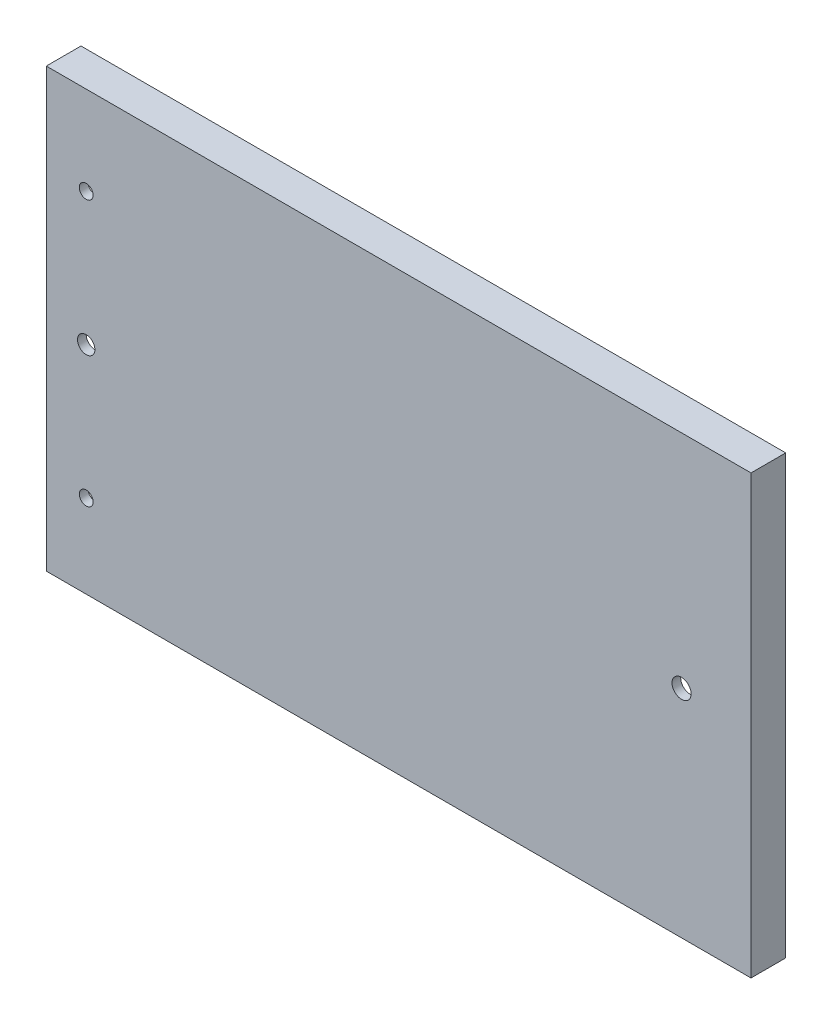
ISO-10303-21;
HEADER;
FILE_DESCRIPTION(('STEP AP214'),'2;1');
FILE_NAME('part.step','',(''),(''),'','','');
FILE_SCHEMA(('AUTOMOTIVE_DESIGN { 1 0 10303 214 1 1 1 1 }'));
ENDSEC;
DATA;
#1=APPLICATION_CONTEXT('core data for automotive mechanical design processes');
#2=APPLICATION_PROTOCOL_DEFINITION('international standard','automotive_design',2000,#1);
#3=PRODUCT_CONTEXT('',#1,'mechanical');
#4=PRODUCT('Part','Part','',(#3));
#5=PRODUCT_RELATED_PRODUCT_CATEGORY('part','',(#4));
#6=PRODUCT_DEFINITION_FORMATION('','',#4);
#7=PRODUCT_DEFINITION_CONTEXT('part definition',#1,'design');
#8=PRODUCT_DEFINITION('design','',#6,#7);
#9=PRODUCT_DEFINITION_SHAPE('','',#8);
#10=(LENGTH_UNIT() NAMED_UNIT(*) SI_UNIT(.MILLI.,.METRE.));
#11=(NAMED_UNIT(*) PLANE_ANGLE_UNIT() SI_UNIT($,.RADIAN.));
#12=(NAMED_UNIT(*) SI_UNIT($,.STERADIAN.) SOLID_ANGLE_UNIT());
#13=UNCERTAINTY_MEASURE_WITH_UNIT(LENGTH_MEASURE(1.E-05),#10,'distance_accuracy_value','');
#14=(GEOMETRIC_REPRESENTATION_CONTEXT(3) GLOBAL_UNCERTAINTY_ASSIGNED_CONTEXT((#13)) GLOBAL_UNIT_ASSIGNED_CONTEXT((#10,
#11,#12)) REPRESENTATION_CONTEXT('',''));
#15=CARTESIAN_POINT('',(0.,0.,0.));
#16=DIRECTION('',(0.,0.,1.));
#17=DIRECTION('',(1.,0.,0.));
#18=AXIS2_PLACEMENT_3D('',#15,#16,#17);
#19=CARTESIAN_POINT('',(0.,0.,20.));
#20=DIRECTION('',(-1.,0.,0.));
#21=DIRECTION('',(0.,0.,1.));
#22=AXIS2_PLACEMENT_3D('',#19,#20,#21);
#23=PLANE('',#22);
#24=DIRECTION('',(0.,1.,0.));
#25=VECTOR('',#24,1.);
#26=CARTESIAN_POINT('',(0.,0.,0.));
#27=LINE('',#26,#25);
#28=CARTESIAN_POINT('',(0.,0.,0.));
#29=VERTEX_POINT('',#28);
#30=CARTESIAN_POINT('',(0.,252.,0.));
#31=VERTEX_POINT('',#30);
#32=EDGE_CURVE('E143',#29,#31,#27,.T.);
#33=ORIENTED_EDGE('',*,*,#32,.F.);
#34=DIRECTION('',(0.,0.,-1.));
#35=VECTOR('',#34,1.);
#36=CARTESIAN_POINT('',(0.,0.,20.));
#37=LINE('',#36,#35);
#38=CARTESIAN_POINT('',(0.,0.,20.));
#39=VERTEX_POINT('',#38);
#40=EDGE_CURVE('E11',#39,#29,#37,.T.);
#41=ORIENTED_EDGE('',*,*,#40,.F.);
#42=DIRECTION('',(0.,1.,0.));
#43=VECTOR('',#42,1.);
#44=CARTESIAN_POINT('',(0.,0.,20.));
#45=LINE('',#44,#43);
#46=CARTESIAN_POINT('',(0.,252.,20.));
#47=VERTEX_POINT('',#46);
#48=EDGE_CURVE('E147',#39,#47,#45,.T.);
#49=ORIENTED_EDGE('',*,*,#48,.T.);
#50=DIRECTION('',(0.,0.,-1.));
#51=VECTOR('',#50,1.);
#52=CARTESIAN_POINT('',(0.,252.,20.));
#53=LINE('',#52,#51);
#54=EDGE_CURVE('E36',#47,#31,#53,.T.);
#55=ORIENTED_EDGE('',*,*,#54,.T.);
#56=EDGE_LOOP('',(#33,#41,#49,#55));
#57=FACE_BOUND('',#56,.T.);
#58=ADVANCED_FACE('F33',(#57),#23,.T.);
#59=CARTESIAN_POINT('',(406.,0.,20.));
#60=DIRECTION('',(0.,-1.,0.));
#61=DIRECTION('',(0.,0.,-1.));
#62=AXIS2_PLACEMENT_3D('',#59,#60,#61);
#63=PLANE('',#62);
#64=DIRECTION('',(-1.,0.,0.));
#65=VECTOR('',#64,1.);
#66=CARTESIAN_POINT('',(406.,0.,0.));
#67=LINE('',#66,#65);
#68=CARTESIAN_POINT('',(406.,0.,0.));
#69=VERTEX_POINT('',#68);
#70=EDGE_CURVE('E150',#69,#29,#67,.T.);
#71=ORIENTED_EDGE('',*,*,#70,.F.);
#72=DIRECTION('',(0.,0.,-1.));
#73=VECTOR('',#72,1.);
#74=CARTESIAN_POINT('',(406.,0.,20.));
#75=LINE('',#74,#73);
#76=CARTESIAN_POINT('',(406.,0.,20.));
#77=VERTEX_POINT('',#76);
#78=EDGE_CURVE('E41',#77,#69,#75,.T.);
#79=ORIENTED_EDGE('',*,*,#78,.F.);
#80=DIRECTION('',(-1.,0.,0.));
#81=VECTOR('',#80,1.);
#82=CARTESIAN_POINT('',(406.,0.,20.));
#83=LINE('',#82,#81);
#84=EDGE_CURVE('E155',#77,#39,#83,.T.);
#85=ORIENTED_EDGE('',*,*,#84,.T.);
#86=ORIENTED_EDGE('',*,*,#40,.T.);
#87=EDGE_LOOP('',(#71,#79,#85,#86));
#88=FACE_BOUND('',#87,.T.);
#89=ADVANCED_FACE('F172',(#88),#63,.T.);
#90=CARTESIAN_POINT('',(406.,252.,20.));
#91=DIRECTION('',(1.,0.,0.));
#92=DIRECTION('',(0.,0.,-1.));
#93=AXIS2_PLACEMENT_3D('',#90,#91,#92);
#94=PLANE('',#93);
#95=DIRECTION('',(0.,-1.,0.));
#96=VECTOR('',#95,1.);
#97=CARTESIAN_POINT('',(406.,252.,0.));
#98=LINE('',#97,#96);
#99=CARTESIAN_POINT('',(406.,252.,0.));
#100=VERTEX_POINT('',#99);
#101=EDGE_CURVE('E162',#100,#69,#98,.T.);
#102=ORIENTED_EDGE('',*,*,#101,.F.);
#103=DIRECTION('',(0.,0.,-1.));
#104=VECTOR('',#103,1.);
#105=CARTESIAN_POINT('',(406.,252.,20.));
#106=LINE('',#105,#104);
#107=CARTESIAN_POINT('',(406.,252.,20.));
#108=VERTEX_POINT('',#107);
#109=EDGE_CURVE('E167',#108,#100,#106,.T.);
#110=ORIENTED_EDGE('',*,*,#109,.F.);
#111=DIRECTION('',(0.,-1.,0.));
#112=VECTOR('',#111,1.);
#113=CARTESIAN_POINT('',(406.,252.,20.));
#114=LINE('',#113,#112);
#115=EDGE_CURVE('E152',#108,#77,#114,.T.);
#116=ORIENTED_EDGE('',*,*,#115,.T.);
#117=ORIENTED_EDGE('',*,*,#78,.T.);
#118=EDGE_LOOP('',(#102,#110,#116,#117));
#119=FACE_BOUND('',#118,.T.);
#120=ADVANCED_FACE('F176',(#119),#94,.T.);
#121=CARTESIAN_POINT('',(0.,252.,20.));
#122=DIRECTION('',(0.,1.,0.));
#123=DIRECTION('',(0.,0.,1.));
#124=AXIS2_PLACEMENT_3D('',#121,#122,#123);
#125=PLANE('',#124);
#126=DIRECTION('',(1.,0.,0.));
#127=VECTOR('',#126,1.);
#128=CARTESIAN_POINT('',(0.,252.,0.));
#129=LINE('',#128,#127);
#130=EDGE_CURVE('E159',#31,#100,#129,.T.);
#131=ORIENTED_EDGE('',*,*,#130,.F.);
#132=ORIENTED_EDGE('',*,*,#54,.F.);
#133=DIRECTION('',(1.,0.,0.));
#134=VECTOR('',#133,1.);
#135=CARTESIAN_POINT('',(0.,252.,20.));
#136=LINE('',#135,#134);
#137=EDGE_CURVE('E149',#47,#108,#136,.T.);
#138=ORIENTED_EDGE('',*,*,#137,.T.);
#139=ORIENTED_EDGE('',*,*,#109,.T.);
#140=EDGE_LOOP('',(#131,#132,#138,#139));
#141=FACE_BOUND('',#140,.T.);
#142=ADVANCED_FACE('F169',(#141),#125,.T.);
#143=CARTESIAN_POINT('',(0.,0.,20.));
#144=DIRECTION('',(0.,0.,-1.));
#145=DIRECTION('',(-1.,0.,0.));
#146=AXIS2_PLACEMENT_3D('',#143,#144,#145);
#147=PLANE('',#146);
#148=CARTESIAN_POINT('',(366.,124.5,20.));
#149=DIRECTION('',(0.,0.,-1.));
#150=DIRECTION('',(-1.,0.,0.));
#151=AXIS2_PLACEMENT_3D('',#148,#149,#150);
#152=CIRCLE('',#151,5.50000000000001);
#153=CARTESIAN_POINT('',(360.5,124.5,20.));
#154=VERTEX_POINT('',#153);
#155=EDGE_CURVE('E306',#154,#154,#152,.T.);
#156=ORIENTED_EDGE('',*,*,#155,.T.);
#157=EDGE_LOOP('',(#156));
#158=FACE_BOUND('',#157,.T.);
#159=CARTESIAN_POINT('',(23.,201.,20.));
#160=DIRECTION('',(0.,0.,-1.));
#161=DIRECTION('',(-1.,0.,0.));
#162=AXIS2_PLACEMENT_3D('',#159,#160,#161);
#163=CIRCLE('',#162,3.99999999999999);
#164=CARTESIAN_POINT('',(19.,201.,20.));
#165=VERTEX_POINT('',#164);
#166=EDGE_CURVE('E316',#165,#165,#163,.T.);
#167=ORIENTED_EDGE('',*,*,#166,.T.);
#168=EDGE_LOOP('',(#167));
#169=FACE_BOUND('',#168,.T.);
#170=CARTESIAN_POINT('',(23.,48.,20.));
#171=DIRECTION('',(0.,0.,-1.));
#172=DIRECTION('',(-1.,0.,0.));
#173=AXIS2_PLACEMENT_3D('',#170,#171,#172);
#174=CIRCLE('',#173,3.99999999999999);
#175=CARTESIAN_POINT('',(19.,48.,20.));
#176=VERTEX_POINT('',#175);
#177=EDGE_CURVE('E322',#176,#176,#174,.T.);
#178=ORIENTED_EDGE('',*,*,#177,.T.);
#179=EDGE_LOOP('',(#178));
#180=FACE_BOUND('',#179,.T.);
#181=CARTESIAN_POINT('',(23.,124.5,20.));
#182=DIRECTION('',(0.,0.,-1.));
#183=DIRECTION('',(-1.,0.,0.));
#184=AXIS2_PLACEMENT_3D('',#181,#182,#183);
#185=CIRCLE('',#184,4.99999999999999);
#186=CARTESIAN_POINT('',(18.,124.5,20.));
#187=VERTEX_POINT('',#186);
#188=EDGE_CURVE('E131',#187,#187,#185,.T.);
#189=ORIENTED_EDGE('',*,*,#188,.T.);
#190=EDGE_LOOP('',(#189));
#191=FACE_BOUND('',#190,.T.);
#192=ORIENTED_EDGE('',*,*,#48,.F.);
#193=ORIENTED_EDGE('',*,*,#84,.F.);
#194=ORIENTED_EDGE('',*,*,#115,.F.);
#195=ORIENTED_EDGE('',*,*,#137,.F.);
#196=EDGE_LOOP('',(#192,#193,#194,#195));
#197=FACE_BOUND('',#196,.T.);
#198=ADVANCED_FACE('F178',(#158,#169,#180,#191,#197),#147,.F.);
#199=CARTESIAN_POINT('',(0.,0.,0.));
#200=DIRECTION('',(0.,0.,-1.));
#201=DIRECTION('',(-1.,0.,0.));
#202=AXIS2_PLACEMENT_3D('',#199,#200,#201);
#203=PLANE('',#202);
#204=DIRECTION('',(1.,0.,0.));
#205=VECTOR('',#204,1.);
#206=CARTESIAN_POINT('',(3.,241.,0.));
#207=LINE('',#206,#205);
#208=CARTESIAN_POINT('',(3.,241.,0.));
#209=VERTEX_POINT('',#208);
#210=CARTESIAN_POINT('',(388.,241.,0.));
#211=VERTEX_POINT('',#210);
#212=EDGE_CURVE('E49',#209,#211,#207,.T.);
#213=ORIENTED_EDGE('',*,*,#212,.F.);
#214=DIRECTION('',(0.,1.,0.));
#215=VECTOR('',#214,1.);
#216=CARTESIAN_POINT('',(3.,8.,0.));
#217=LINE('',#216,#215);
#218=CARTESIAN_POINT('',(3.,8.,0.));
#219=VERTEX_POINT('',#218);
#220=EDGE_CURVE('E125',#219,#209,#217,.T.);
#221=ORIENTED_EDGE('',*,*,#220,.F.);
#222=DIRECTION('',(-1.,0.,0.));
#223=VECTOR('',#222,1.);
#224=CARTESIAN_POINT('',(388.,8.00000000000001,0.));
#225=LINE('',#224,#223);
#226=CARTESIAN_POINT('',(388.,8.00000000000001,0.));
#227=VERTEX_POINT('',#226);
#228=EDGE_CURVE('E128',#227,#219,#225,.T.);
#229=ORIENTED_EDGE('',*,*,#228,.F.);
#230=DIRECTION('',(0.,-1.,0.));
#231=VECTOR('',#230,1.);
#232=CARTESIAN_POINT('',(388.,241.,0.));
#233=LINE('',#232,#231);
#234=EDGE_CURVE('E137',#211,#227,#233,.T.);
#235=ORIENTED_EDGE('',*,*,#234,.F.);
#236=EDGE_LOOP('',(#213,#221,#229,#235));
#237=FACE_BOUND('',#236,.T.);
#238=ORIENTED_EDGE('',*,*,#32,.T.);
#239=ORIENTED_EDGE('',*,*,#130,.T.);
#240=ORIENTED_EDGE('',*,*,#101,.T.);
#241=ORIENTED_EDGE('',*,*,#70,.T.);
#242=EDGE_LOOP('',(#238,#239,#240,#241));
#243=FACE_BOUND('',#242,.T.);
#244=ADVANCED_FACE('F171',(#237,#243),#203,.T.);
#245=CARTESIAN_POINT('',(3.,241.,15.));
#246=DIRECTION('',(0.,1.,0.));
#247=DIRECTION('',(0.,0.,1.));
#248=AXIS2_PLACEMENT_3D('',#245,#246,#247);
#249=PLANE('',#248);
#250=ORIENTED_EDGE('',*,*,#212,.T.);
#251=DIRECTION('',(0.,0.,-1.));
#252=VECTOR('',#251,1.);
#253=CARTESIAN_POINT('',(388.,241.,15.));
#254=LINE('',#253,#252);
#255=CARTESIAN_POINT('',(388.,241.,15.));
#256=VERTEX_POINT('',#255);
#257=EDGE_CURVE('E103',#256,#211,#254,.T.);
#258=ORIENTED_EDGE('',*,*,#257,.F.);
#259=DIRECTION('',(1.,0.,0.));
#260=VECTOR('',#259,1.);
#261=CARTESIAN_POINT('',(3.,241.,15.));
#262=LINE('',#261,#260);
#263=CARTESIAN_POINT('',(3.,241.,15.));
#264=VERTEX_POINT('',#263);
#265=EDGE_CURVE('E107',#264,#256,#262,.T.);
#266=ORIENTED_EDGE('',*,*,#265,.F.);
#267=DIRECTION('',(0.,0.,-1.));
#268=VECTOR('',#267,1.);
#269=CARTESIAN_POINT('',(3.,241.,15.));
#270=LINE('',#269,#268);
#271=EDGE_CURVE('E141',#264,#209,#270,.T.);
#272=ORIENTED_EDGE('',*,*,#271,.T.);
#273=EDGE_LOOP('',(#250,#258,#266,#272));
#274=FACE_BOUND('',#273,.T.);
#275=ADVANCED_FACE('F105',(#274),#249,.F.);
#276=CARTESIAN_POINT('',(3.,8.,15.));
#277=DIRECTION('',(-1.,0.,0.));
#278=DIRECTION('',(0.,-1.,0.));
#279=AXIS2_PLACEMENT_3D('',#276,#277,#278);
#280=PLANE('',#279);
#281=ORIENTED_EDGE('',*,*,#220,.T.);
#282=ORIENTED_EDGE('',*,*,#271,.F.);
#283=DIRECTION('',(0.,1.,0.));
#284=VECTOR('',#283,1.);
#285=CARTESIAN_POINT('',(3.,8.,15.));
#286=LINE('',#285,#284);
#287=CARTESIAN_POINT('',(3.,8.,15.));
#288=VERTEX_POINT('',#287);
#289=EDGE_CURVE('E113',#288,#264,#286,.T.);
#290=ORIENTED_EDGE('',*,*,#289,.F.);
#291=DIRECTION('',(0.,0.,-1.));
#292=VECTOR('',#291,1.);
#293=CARTESIAN_POINT('',(3.,8.,15.));
#294=LINE('',#293,#292);
#295=EDGE_CURVE('E144',#288,#219,#294,.T.);
#296=ORIENTED_EDGE('',*,*,#295,.T.);
#297=EDGE_LOOP('',(#281,#282,#290,#296));
#298=FACE_BOUND('',#297,.T.);
#299=ADVANCED_FACE('F222',(#298),#280,.F.);
#300=CARTESIAN_POINT('',(388.,8.00000000000001,15.));
#301=DIRECTION('',(0.,-1.,0.));
#302=DIRECTION('',(1.,0.,0.));
#303=AXIS2_PLACEMENT_3D('',#300,#301,#302);
#304=PLANE('',#303);
#305=ORIENTED_EDGE('',*,*,#228,.T.);
#306=ORIENTED_EDGE('',*,*,#295,.F.);
#307=DIRECTION('',(-1.,0.,0.));
#308=VECTOR('',#307,1.);
#309=CARTESIAN_POINT('',(388.,8.00000000000001,15.));
#310=LINE('',#309,#308);
#311=CARTESIAN_POINT('',(388.,8.00000000000001,15.));
#312=VERTEX_POINT('',#311);
#313=EDGE_CURVE('E121',#312,#288,#310,.T.);
#314=ORIENTED_EDGE('',*,*,#313,.F.);
#315=DIRECTION('',(0.,0.,-1.));
#316=VECTOR('',#315,1.);
#317=CARTESIAN_POINT('',(388.,8.00000000000001,15.));
#318=LINE('',#317,#316);
#319=EDGE_CURVE('E112',#312,#227,#318,.T.);
#320=ORIENTED_EDGE('',*,*,#319,.T.);
#321=EDGE_LOOP('',(#305,#306,#314,#320));
#322=FACE_BOUND('',#321,.T.);
#323=ADVANCED_FACE('F230',(#322),#304,.F.);
#324=CARTESIAN_POINT('',(388.,241.,15.));
#325=DIRECTION('',(1.,0.,0.));
#326=DIRECTION('',(0.,0.,-1.));
#327=AXIS2_PLACEMENT_3D('',#324,#325,#326);
#328=PLANE('',#327);
#329=ORIENTED_EDGE('',*,*,#234,.T.);
#330=ORIENTED_EDGE('',*,*,#319,.F.);
#331=DIRECTION('',(0.,-1.,0.));
#332=VECTOR('',#331,1.);
#333=CARTESIAN_POINT('',(388.,241.,15.));
#334=LINE('',#333,#332);
#335=EDGE_CURVE('E116',#256,#312,#334,.T.);
#336=ORIENTED_EDGE('',*,*,#335,.F.);
#337=ORIENTED_EDGE('',*,*,#257,.T.);
#338=EDGE_LOOP('',(#329,#330,#336,#337));
#339=FACE_BOUND('',#338,.T.);
#340=ADVANCED_FACE('F117',(#339),#328,.F.);
#341=CARTESIAN_POINT('',(0.,0.,15.));
#342=DIRECTION('',(0.,0.,-1.));
#343=DIRECTION('',(-1.,0.,0.));
#344=AXIS2_PLACEMENT_3D('',#341,#342,#343);
#345=PLANE('',#344);
#346=CARTESIAN_POINT('',(366.,124.5,15.));
#347=DIRECTION('',(0.,0.,-1.));
#348=DIRECTION('',(-1.,0.,0.));
#349=AXIS2_PLACEMENT_3D('',#346,#347,#348);
#350=CIRCLE('',#349,5.50000000000001);
#351=CARTESIAN_POINT('',(360.5,124.5,15.));
#352=VERTEX_POINT('',#351);
#353=EDGE_CURVE('E309',#352,#352,#350,.T.);
#354=ORIENTED_EDGE('',*,*,#353,.F.);
#355=EDGE_LOOP('',(#354));
#356=FACE_BOUND('',#355,.T.);
#357=CARTESIAN_POINT('',(23.,201.,15.));
#358=DIRECTION('',(0.,0.,-1.));
#359=DIRECTION('',(-1.,0.,0.));
#360=AXIS2_PLACEMENT_3D('',#357,#358,#359);
#361=CIRCLE('',#360,3.99999999999999);
#362=CARTESIAN_POINT('',(19.,201.,15.));
#363=VERTEX_POINT('',#362);
#364=EDGE_CURVE('E311',#363,#363,#361,.T.);
#365=ORIENTED_EDGE('',*,*,#364,.F.);
#366=EDGE_LOOP('',(#365));
#367=FACE_BOUND('',#366,.T.);
#368=CARTESIAN_POINT('',(23.,48.,15.));
#369=DIRECTION('',(0.,0.,-1.));
#370=DIRECTION('',(-1.,0.,0.));
#371=AXIS2_PLACEMENT_3D('',#368,#369,#370);
#372=CIRCLE('',#371,3.99999999999999);
#373=CARTESIAN_POINT('',(19.,48.,15.));
#374=VERTEX_POINT('',#373);
#375=EDGE_CURVE('E319',#374,#374,#372,.T.);
#376=ORIENTED_EDGE('',*,*,#375,.F.);
#377=EDGE_LOOP('',(#376));
#378=FACE_BOUND('',#377,.T.);
#379=CARTESIAN_POINT('',(23.,124.5,15.));
#380=DIRECTION('',(0.,0.,-1.));
#381=DIRECTION('',(-1.,0.,0.));
#382=AXIS2_PLACEMENT_3D('',#379,#380,#381);
#383=CIRCLE('',#382,4.99999999999999);
#384=CARTESIAN_POINT('',(18.,124.5,15.));
#385=VERTEX_POINT('',#384);
#386=EDGE_CURVE('E324',#385,#385,#383,.T.);
#387=ORIENTED_EDGE('',*,*,#386,.F.);
#388=EDGE_LOOP('',(#387));
#389=FACE_BOUND('',#388,.T.);
#390=ORIENTED_EDGE('',*,*,#265,.T.);
#391=ORIENTED_EDGE('',*,*,#335,.T.);
#392=ORIENTED_EDGE('',*,*,#313,.T.);
#393=ORIENTED_EDGE('',*,*,#289,.T.);
#394=EDGE_LOOP('',(#390,#391,#392,#393));
#395=FACE_BOUND('',#394,.T.);
#396=ADVANCED_FACE('F123',(#356,#367,#378,#389,#395),#345,.T.);
#397=CARTESIAN_POINT('',(23.,124.5,15.));
#398=DIRECTION('',(0.,0.,-1.));
#399=DIRECTION('',(-1.,0.,0.));
#400=AXIS2_PLACEMENT_3D('',#397,#398,#399);
#401=CYLINDRICAL_SURFACE('',#400,4.99999999999999);
#402=ORIENTED_EDGE('',*,*,#188,.F.);
#403=EDGE_LOOP('',(#402));
#404=FACE_BOUND('',#403,.T.);
#405=ORIENTED_EDGE('',*,*,#386,.T.);
#406=EDGE_LOOP('',(#405));
#407=FACE_BOUND('',#406,.T.);
#408=ADVANCED_FACE('F255',(#404,#407),#401,.F.);
#409=CARTESIAN_POINT('',(23.,48.,15.));
#410=DIRECTION('',(0.,0.,-1.));
#411=DIRECTION('',(-1.,0.,0.));
#412=AXIS2_PLACEMENT_3D('',#409,#410,#411);
#413=CYLINDRICAL_SURFACE('',#412,3.99999999999999);
#414=ORIENTED_EDGE('',*,*,#177,.F.);
#415=EDGE_LOOP('',(#414));
#416=FACE_BOUND('',#415,.T.);
#417=ORIENTED_EDGE('',*,*,#375,.T.);
#418=EDGE_LOOP('',(#417));
#419=FACE_BOUND('',#418,.T.);
#420=ADVANCED_FACE('F260',(#416,#419),#413,.F.);
#421=CARTESIAN_POINT('',(23.,201.,15.));
#422=DIRECTION('',(0.,0.,-1.));
#423=DIRECTION('',(-1.,0.,0.));
#424=AXIS2_PLACEMENT_3D('',#421,#422,#423);
#425=CYLINDRICAL_SURFACE('',#424,3.99999999999999);
#426=ORIENTED_EDGE('',*,*,#166,.F.);
#427=EDGE_LOOP('',(#426));
#428=FACE_BOUND('',#427,.T.);
#429=ORIENTED_EDGE('',*,*,#364,.T.);
#430=EDGE_LOOP('',(#429));
#431=FACE_BOUND('',#430,.T.);
#432=ADVANCED_FACE('F270',(#428,#431),#425,.F.);
#433=CARTESIAN_POINT('',(366.,124.5,15.));
#434=DIRECTION('',(0.,0.,-1.));
#435=DIRECTION('',(-1.,0.,0.));
#436=AXIS2_PLACEMENT_3D('',#433,#434,#435);
#437=CYLINDRICAL_SURFACE('',#436,5.50000000000001);
#438=ORIENTED_EDGE('',*,*,#155,.F.);
#439=EDGE_LOOP('',(#438));
#440=FACE_BOUND('',#439,.T.);
#441=ORIENTED_EDGE('',*,*,#353,.T.);
#442=EDGE_LOOP('',(#441));
#443=FACE_BOUND('',#442,.T.);
#444=ADVANCED_FACE('F279',(#440,#443),#437,.F.);
#445=CLOSED_SHELL('',(#58,#89,#120,#142,#198,#244,#275,#299,#323,#340,#396,#408,#420,#432,#444));
#446=MANIFOLD_SOLID_BREP('B2',#445);
#447=ADVANCED_BREP_SHAPE_REPRESENTATION('',(#18,#446),#14);
#448=SHAPE_DEFINITION_REPRESENTATION(#9,#447);
ENDSEC;
END-ISO-10303-21;
